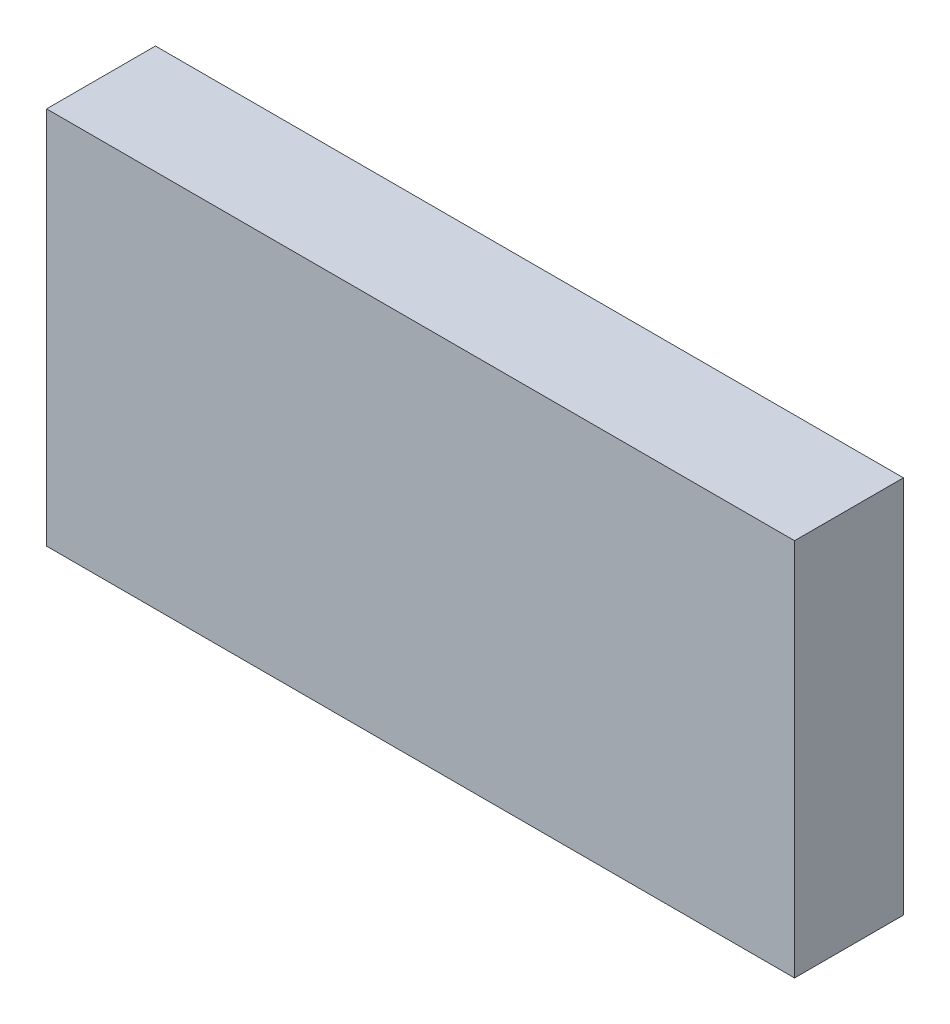
ISO-10303-21;
HEADER;
FILE_DESCRIPTION(('STEP AP214'),'2;1');
FILE_NAME('part.step','',(''),(''),'','','');
FILE_SCHEMA(('AUTOMOTIVE_DESIGN { 1 0 10303 214 1 1 1 1 }'));
ENDSEC;
DATA;
#1=APPLICATION_CONTEXT('core data for automotive mechanical design processes');
#2=APPLICATION_PROTOCOL_DEFINITION('international standard','automotive_design',2000,#1);
#3=PRODUCT_CONTEXT('',#1,'mechanical');
#4=PRODUCT('Part','Part','',(#3));
#5=PRODUCT_RELATED_PRODUCT_CATEGORY('part','',(#4));
#6=PRODUCT_DEFINITION_FORMATION('','',#4);
#7=PRODUCT_DEFINITION_CONTEXT('part definition',#1,'design');
#8=PRODUCT_DEFINITION('design','',#6,#7);
#9=PRODUCT_DEFINITION_SHAPE('','',#8);
#10=(LENGTH_UNIT() NAMED_UNIT(*) SI_UNIT(.MILLI.,.METRE.));
#11=(NAMED_UNIT(*) PLANE_ANGLE_UNIT() SI_UNIT($,.RADIAN.));
#12=(NAMED_UNIT(*) SI_UNIT($,.STERADIAN.) SOLID_ANGLE_UNIT());
#13=UNCERTAINTY_MEASURE_WITH_UNIT(LENGTH_MEASURE(1.E-05),#10,'distance_accuracy_value','');
#14=(GEOMETRIC_REPRESENTATION_CONTEXT(3) GLOBAL_UNCERTAINTY_ASSIGNED_CONTEXT((#13)) GLOBAL_UNIT_ASSIGNED_CONTEXT((#10,
#11,#12)) REPRESENTATION_CONTEXT('',''));
#15=CARTESIAN_POINT('',(0.,0.,0.));
#16=DIRECTION('',(0.,0.,1.));
#17=DIRECTION('',(1.,0.,0.));
#18=AXIS2_PLACEMENT_3D('',#15,#16,#17);
#19=CARTESIAN_POINT('',(62.70625,-31.75,9.128125));
#20=DIRECTION('',(-1.,0.,0.));
#21=DIRECTION('',(0.,0.,1.));
#22=AXIS2_PLACEMENT_3D('',#19,#20,#21);
#23=PLANE('',#22);
#24=DIRECTION('',(0.,1.,0.));
#25=VECTOR('',#24,1.);
#26=CARTESIAN_POINT('',(62.70625,-31.75,-9.128125));
#27=LINE('',#26,#25);
#28=CARTESIAN_POINT('',(62.70625,-31.75,-9.128125));
#29=VERTEX_POINT('',#28);
#30=CARTESIAN_POINT('',(62.70625,31.75,-9.128125));
#31=VERTEX_POINT('',#30);
#32=EDGE_CURVE('E96',#29,#31,#27,.T.);
#33=ORIENTED_EDGE('',*,*,#32,.T.);
#34=DIRECTION('',(0.,0.,-1.));
#35=VECTOR('',#34,1.);
#36=CARTESIAN_POINT('',(62.70625,31.75,9.128125));
#37=LINE('',#36,#35);
#38=CARTESIAN_POINT('',(62.70625,31.75,9.128125));
#39=VERTEX_POINT('',#38);
#40=EDGE_CURVE('E11',#39,#31,#37,.T.);
#41=ORIENTED_EDGE('',*,*,#40,.F.);
#42=DIRECTION('',(0.,1.,0.));
#43=VECTOR('',#42,1.);
#44=CARTESIAN_POINT('',(62.70625,-31.75,9.128125));
#45=LINE('',#44,#43);
#46=CARTESIAN_POINT('',(62.70625,-31.75,9.128125));
#47=VERTEX_POINT('',#46);
#48=EDGE_CURVE('E84',#47,#39,#45,.T.);
#49=ORIENTED_EDGE('',*,*,#48,.F.);
#50=DIRECTION('',(0.,0.,-1.));
#51=VECTOR('',#50,1.);
#52=CARTESIAN_POINT('',(62.70625,-31.75,9.128125));
#53=LINE('',#52,#51);
#54=EDGE_CURVE('E92',#47,#29,#53,.T.);
#55=ORIENTED_EDGE('',*,*,#54,.T.);
#56=EDGE_LOOP('',(#33,#41,#49,#55));
#57=FACE_BOUND('',#56,.T.);
#58=ADVANCED_FACE('F33',(#57),#23,.F.);
#59=CARTESIAN_POINT('',(-62.70625,31.75,9.128125));
#60=DIRECTION('',(0.,-1.,0.));
#61=DIRECTION('',(0.,0.,-1.));
#62=AXIS2_PLACEMENT_3D('',#59,#60,#61);
#63=PLANE('',#62);
#64=DIRECTION('',(-1.,0.,0.));
#65=VECTOR('',#64,1.);
#66=CARTESIAN_POINT('',(-62.70625,31.75,-9.128125));
#67=LINE('',#66,#65);
#68=CARTESIAN_POINT('',(-62.70625,31.75,-9.128125));
#69=VERTEX_POINT('',#68);
#70=EDGE_CURVE('E88',#31,#69,#67,.T.);
#71=ORIENTED_EDGE('',*,*,#70,.T.);
#72=DIRECTION('',(0.,0.,-1.));
#73=VECTOR('',#72,1.);
#74=CARTESIAN_POINT('',(-62.70625,31.75,9.128125));
#75=LINE('',#74,#73);
#76=CARTESIAN_POINT('',(-62.70625,31.75,9.128125));
#77=VERTEX_POINT('',#76);
#78=EDGE_CURVE('E41',#77,#69,#75,.T.);
#79=ORIENTED_EDGE('',*,*,#78,.F.);
#80=DIRECTION('',(-1.,0.,0.));
#81=VECTOR('',#80,1.);
#82=CARTESIAN_POINT('',(-62.70625,31.75,9.128125));
#83=LINE('',#82,#81);
#84=EDGE_CURVE('E79',#39,#77,#83,.T.);
#85=ORIENTED_EDGE('',*,*,#84,.F.);
#86=ORIENTED_EDGE('',*,*,#40,.T.);
#87=EDGE_LOOP('',(#71,#79,#85,#86));
#88=FACE_BOUND('',#87,.T.);
#89=ADVANCED_FACE('F87',(#88),#63,.F.);
#90=CARTESIAN_POINT('',(-62.70625,-31.75,9.128125));
#91=DIRECTION('',(1.,0.,0.));
#92=DIRECTION('',(0.,0.,-1.));
#93=AXIS2_PLACEMENT_3D('',#90,#91,#92);
#94=PLANE('',#93);
#95=DIRECTION('',(0.,-1.,0.));
#96=VECTOR('',#95,1.);
#97=CARTESIAN_POINT('',(-62.70625,-31.75,-9.128125));
#98=LINE('',#97,#96);
#99=CARTESIAN_POINT('',(-62.70625,-31.75,-9.128125));
#100=VERTEX_POINT('',#99);
#101=EDGE_CURVE('E66',#69,#100,#98,.T.);
#102=ORIENTED_EDGE('',*,*,#101,.T.);
#103=DIRECTION('',(0.,0.,-1.));
#104=VECTOR('',#103,1.);
#105=CARTESIAN_POINT('',(-62.70625,-31.75,9.128125));
#106=LINE('',#105,#104);
#107=CARTESIAN_POINT('',(-62.70625,-31.75,9.128125));
#108=VERTEX_POINT('',#107);
#109=EDGE_CURVE('E89',#108,#100,#106,.T.);
#110=ORIENTED_EDGE('',*,*,#109,.F.);
#111=DIRECTION('',(0.,-1.,0.));
#112=VECTOR('',#111,1.);
#113=CARTESIAN_POINT('',(-62.70625,-31.75,9.128125));
#114=LINE('',#113,#112);
#115=EDGE_CURVE('E82',#77,#108,#114,.T.);
#116=ORIENTED_EDGE('',*,*,#115,.F.);
#117=ORIENTED_EDGE('',*,*,#78,.T.);
#118=EDGE_LOOP('',(#102,#110,#116,#117));
#119=FACE_BOUND('',#118,.T.);
#120=ADVANCED_FACE('F90',(#119),#94,.F.);
#121=CARTESIAN_POINT('',(-62.70625,-31.75,9.128125));
#122=DIRECTION('',(0.,1.,0.));
#123=DIRECTION('',(0.,0.,1.));
#124=AXIS2_PLACEMENT_3D('',#121,#122,#123);
#125=PLANE('',#124);
#126=DIRECTION('',(1.,0.,0.));
#127=VECTOR('',#126,1.);
#128=CARTESIAN_POINT('',(-62.70625,-31.75,-9.128125));
#129=LINE('',#128,#127);
#130=EDGE_CURVE('E72',#100,#29,#129,.T.);
#131=ORIENTED_EDGE('',*,*,#130,.T.);
#132=ORIENTED_EDGE('',*,*,#54,.F.);
#133=DIRECTION('',(1.,0.,0.));
#134=VECTOR('',#133,1.);
#135=CARTESIAN_POINT('',(-62.70625,-31.75,9.128125));
#136=LINE('',#135,#134);
#137=EDGE_CURVE('E49',#108,#47,#136,.T.);
#138=ORIENTED_EDGE('',*,*,#137,.F.);
#139=ORIENTED_EDGE('',*,*,#109,.T.);
#140=EDGE_LOOP('',(#131,#132,#138,#139));
#141=FACE_BOUND('',#140,.T.);
#142=ADVANCED_FACE('F103',(#141),#125,.F.);
#143=CARTESIAN_POINT('',(0.,0.,9.128125));
#144=DIRECTION('',(0.,0.,-1.));
#145=DIRECTION('',(-1.,0.,0.));
#146=AXIS2_PLACEMENT_3D('',#143,#144,#145);
#147=PLANE('',#146);
#148=ORIENTED_EDGE('',*,*,#48,.T.);
#149=ORIENTED_EDGE('',*,*,#84,.T.);
#150=ORIENTED_EDGE('',*,*,#115,.T.);
#151=ORIENTED_EDGE('',*,*,#137,.T.);
#152=EDGE_LOOP('',(#148,#149,#150,#151));
#153=FACE_BOUND('',#152,.T.);
#154=ADVANCED_FACE('F80',(#153),#147,.F.);
#155=CARTESIAN_POINT('',(0.,0.,-9.128125));
#156=DIRECTION('',(0.,0.,-1.));
#157=DIRECTION('',(-1.,0.,0.));
#158=AXIS2_PLACEMENT_3D('',#155,#156,#157);
#159=PLANE('',#158);
#160=ORIENTED_EDGE('',*,*,#32,.F.);
#161=ORIENTED_EDGE('',*,*,#130,.F.);
#162=ORIENTED_EDGE('',*,*,#101,.F.);
#163=ORIENTED_EDGE('',*,*,#70,.F.);
#164=EDGE_LOOP('',(#160,#161,#162,#163));
#165=FACE_BOUND('',#164,.T.);
#166=ADVANCED_FACE('F106',(#165),#159,.T.);
#167=CLOSED_SHELL('',(#58,#89,#120,#142,#154,#166));
#168=MANIFOLD_SOLID_BREP('B2',#167);
#169=ADVANCED_BREP_SHAPE_REPRESENTATION('',(#18,#168),#14);
#170=SHAPE_DEFINITION_REPRESENTATION(#9,#169);
ENDSEC;
END-ISO-10303-21;
